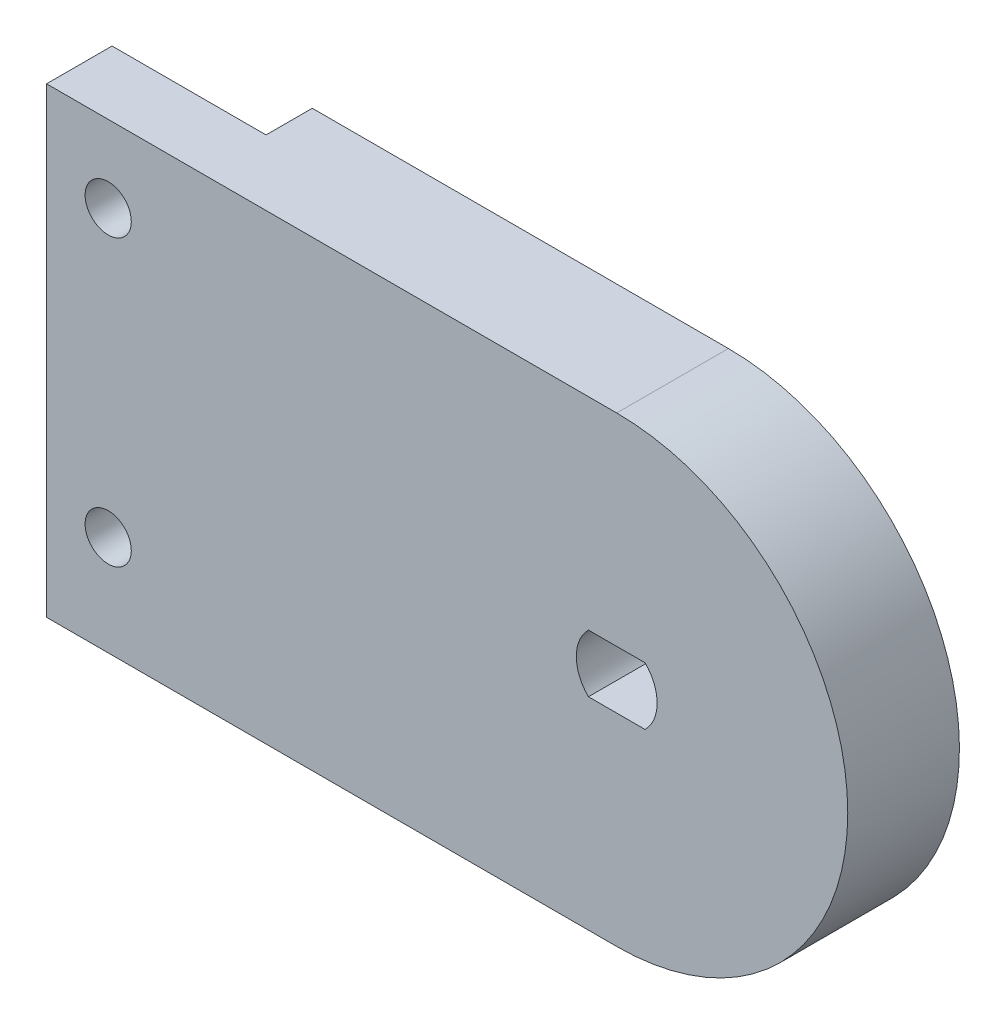
ISO-10303-21;
HEADER;
FILE_DESCRIPTION(('STEP AP214'),'2;1');
FILE_NAME('part.step','',(''),(''),'','','');
FILE_SCHEMA(('AUTOMOTIVE_DESIGN { 1 0 10303 214 1 1 1 1 }'));
ENDSEC;
DATA;
#1=APPLICATION_CONTEXT('core data for automotive mechanical design processes');
#2=APPLICATION_PROTOCOL_DEFINITION('international standard','automotive_design',2000,#1);
#3=PRODUCT_CONTEXT('',#1,'mechanical');
#4=PRODUCT('Part','Part','',(#3));
#5=PRODUCT_RELATED_PRODUCT_CATEGORY('part','',(#4));
#6=PRODUCT_DEFINITION_FORMATION('','',#4);
#7=PRODUCT_DEFINITION_CONTEXT('part definition',#1,'design');
#8=PRODUCT_DEFINITION('design','',#6,#7);
#9=PRODUCT_DEFINITION_SHAPE('','',#8);
#10=(LENGTH_UNIT() NAMED_UNIT(*) SI_UNIT(.MILLI.,.METRE.));
#11=(NAMED_UNIT(*) PLANE_ANGLE_UNIT() SI_UNIT($,.RADIAN.));
#12=(NAMED_UNIT(*) SI_UNIT($,.STERADIAN.) SOLID_ANGLE_UNIT());
#13=UNCERTAINTY_MEASURE_WITH_UNIT(LENGTH_MEASURE(1.E-05),#10,'distance_accuracy_value','');
#14=(GEOMETRIC_REPRESENTATION_CONTEXT(3) GLOBAL_UNCERTAINTY_ASSIGNED_CONTEXT((#13)) GLOBAL_UNIT_ASSIGNED_CONTEXT((#10,
#11,#12)) REPRESENTATION_CONTEXT('',''));
#15=CARTESIAN_POINT('',(0.,0.,0.));
#16=DIRECTION('',(0.,0.,1.));
#17=DIRECTION('',(1.,0.,0.));
#18=AXIS2_PLACEMENT_3D('',#15,#16,#17);
#19=CARTESIAN_POINT('',(-62.7873867556089,0.,0.));
#20=DIRECTION('',(-1.,0.,0.));
#21=DIRECTION('',(0.,0.,1.));
#22=AXIS2_PLACEMENT_3D('',#19,#20,#21);
#23=PLANE('',#22);
#24=DIRECTION('',(0.,0.,1.));
#25=VECTOR('',#24,1.);
#26=CARTESIAN_POINT('',(-62.7873867556089,215.180299853942,-36.0000000000004));
#27=LINE('',#26,#25);
#28=CARTESIAN_POINT('',(-62.7873867556089,215.180299853942,-33.0000000000004));
#29=VERTEX_POINT('',#28);
#30=CARTESIAN_POINT('',(-62.7873867556089,215.180299853942,-28.7500000000003));
#31=VERTEX_POINT('',#30);
#32=EDGE_CURVE('E138',#29,#31,#27,.T.);
#33=ORIENTED_EDGE('',*,*,#32,.T.);
#34=DIRECTION('',(0.,1.,0.));
#35=VECTOR('',#34,1.);
#36=CARTESIAN_POINT('',(-62.7873867556089,0.,-28.7500000000003));
#37=LINE('',#36,#35);
#38=CARTESIAN_POINT('',(-62.7873867556089,245.180299853942,-28.7500000000003));
#39=VERTEX_POINT('',#38);
#40=EDGE_CURVE('E123',#31,#39,#37,.T.);
#41=ORIENTED_EDGE('',*,*,#40,.T.);
#42=DIRECTION('',(0.,0.,-1.));
#43=VECTOR('',#42,1.);
#44=CARTESIAN_POINT('',(-62.7873867556089,245.180299853942,-36.0000000000004));
#45=LINE('',#44,#43);
#46=CARTESIAN_POINT('',(-62.7873867556089,245.180299853942,-33.0000000000004));
#47=VERTEX_POINT('',#46);
#48=EDGE_CURVE('E135',#39,#47,#45,.T.);
#49=ORIENTED_EDGE('',*,*,#48,.T.);
#50=DIRECTION('',(0.,-1.,0.));
#51=VECTOR('',#50,1.);
#52=CARTESIAN_POINT('',(-62.7873867556089,0.,-33.0000000000004));
#53=LINE('',#52,#51);
#54=EDGE_CURVE('E246',#47,#29,#53,.T.);
#55=ORIENTED_EDGE('',*,*,#54,.T.);
#56=EDGE_LOOP('',(#33,#41,#49,#55));
#57=FACE_BOUND('',#56,.T.);
#58=ADVANCED_FACE('F39',(#57),#23,.T.);
#59=CARTESIAN_POINT('',(-54.7873867556089,215.180299853942,-2.60208521396521E-13));
#60=DIRECTION('',(0.,1.,0.));
#61=DIRECTION('',(0.,0.,1.));
#62=AXIS2_PLACEMENT_3D('',#59,#60,#61);
#63=PLANE('',#62);
#64=DIRECTION('',(1.,0.,0.));
#65=VECTOR('',#64,1.);
#66=CARTESIAN_POINT('',(-39.7873867556089,215.180299853942,-28.7500000000003));
#67=LINE('',#66,#65);
#68=CARTESIAN_POINT('',(-25.7691853433519,215.180299853942,-28.7500000000003));
#69=VERTEX_POINT('',#68);
#70=EDGE_CURVE('E188',#31,#69,#67,.T.);
#71=ORIENTED_EDGE('',*,*,#70,.F.);
#72=ORIENTED_EDGE('',*,*,#32,.F.);
#73=DIRECTION('',(-1.,0.,0.));
#74=VECTOR('',#73,1.);
#75=CARTESIAN_POINT('',(-52.7873867569757,215.180299853942,-33.0000000000004));
#76=LINE('',#75,#74);
#77=CARTESIAN_POINT('',(-52.7873867569757,215.180299853942,-33.0000000000004));
#78=VERTEX_POINT('',#77);
#79=EDGE_CURVE('E240',#78,#29,#76,.T.);
#80=ORIENTED_EDGE('',*,*,#79,.F.);
#81=DIRECTION('',(-1.,0.,0.));
#82=VECTOR('',#81,1.);
#83=CARTESIAN_POINT('',(-10.7691853433519,215.180299853942,-33.0000000000004));
#84=LINE('',#83,#82);
#85=CARTESIAN_POINT('',(-25.7691853433519,215.180299853942,-33.0000000000004));
#86=VERTEX_POINT('',#85);
#87=EDGE_CURVE('E203',#86,#78,#84,.T.);
#88=ORIENTED_EDGE('',*,*,#87,.F.);
#89=DIRECTION('',(0.,0.,1.));
#90=VECTOR('',#89,1.);
#91=CARTESIAN_POINT('',(-25.7691853433519,215.180299853942,-36.0000000000003));
#92=LINE('',#91,#90);
#93=EDGE_CURVE('E149',#86,#69,#92,.T.);
#94=ORIENTED_EDGE('',*,*,#93,.T.);
#95=EDGE_LOOP('',(#71,#72,#80,#88,#94));
#96=FACE_BOUND('',#95,.T.);
#97=ADVANCED_FACE('F177',(#96),#63,.F.);
#98=CARTESIAN_POINT('',(-25.7691853433519,245.180299853942,-2.60208521396521E-13));
#99=DIRECTION('',(0.,-1.,0.));
#100=DIRECTION('',(0.,0.,-1.));
#101=AXIS2_PLACEMENT_3D('',#98,#99,#100);
#102=PLANE('',#101);
#103=ORIENTED_EDGE('',*,*,#48,.F.);
#104=DIRECTION('',(-1.,0.,0.));
#105=VECTOR('',#104,1.);
#106=CARTESIAN_POINT('',(-25.7691853433519,245.180299853942,-28.7500000000003));
#107=LINE('',#106,#105);
#108=CARTESIAN_POINT('',(-25.7691853433519,245.180299853942,-28.7500000000003));
#109=VERTEX_POINT('',#108);
#110=EDGE_CURVE('E120',#109,#39,#107,.T.);
#111=ORIENTED_EDGE('',*,*,#110,.F.);
#112=DIRECTION('',(0.,0.,1.));
#113=VECTOR('',#112,1.);
#114=CARTESIAN_POINT('',(-25.7691853433519,245.180299853942,-36.0000000000003));
#115=LINE('',#114,#113);
#116=CARTESIAN_POINT('',(-25.7691853433519,245.180299853942,-36.0000000000003));
#117=VERTEX_POINT('',#116);
#118=EDGE_CURVE('E231',#117,#109,#115,.T.);
#119=ORIENTED_EDGE('',*,*,#118,.F.);
#120=DIRECTION('',(1.,0.,0.));
#121=VECTOR('',#120,1.);
#122=CARTESIAN_POINT('',(-62.7873867556089,245.180299853942,-36.0000000000004));
#123=LINE('',#122,#121);
#124=CARTESIAN_POINT('',(-52.7873867569757,245.180299853942,-36.0000000000004));
#125=VERTEX_POINT('',#124);
#126=EDGE_CURVE('E145',#125,#117,#123,.T.);
#127=ORIENTED_EDGE('',*,*,#126,.F.);
#128=DIRECTION('',(0.,0.,1.));
#129=VECTOR('',#128,1.);
#130=CARTESIAN_POINT('',(-52.7873867569757,245.180299853942,-2.60208521396521E-13));
#131=LINE('',#130,#129);
#132=CARTESIAN_POINT('',(-52.7873867569757,245.180299853942,-33.0000000000004));
#133=VERTEX_POINT('',#132);
#134=EDGE_CURVE('E192',#125,#133,#131,.T.);
#135=ORIENTED_EDGE('',*,*,#134,.T.);
#136=DIRECTION('',(1.,0.,0.));
#137=VECTOR('',#136,1.);
#138=CARTESIAN_POINT('',(-25.7691853433519,245.180299853942,-33.0000000000004));
#139=LINE('',#138,#137);
#140=EDGE_CURVE('E144',#47,#133,#139,.T.);
#141=ORIENTED_EDGE('',*,*,#140,.F.);
#142=EDGE_LOOP('',(#103,#111,#119,#127,#135,#141));
#143=FACE_BOUND('',#142,.T.);
#144=ADVANCED_FACE('F41',(#143),#102,.F.);
#145=CARTESIAN_POINT('',(-58.7873431196309,221.679985831261,-40.2426406871329));
#146=DIRECTION('',(0.,0.,1.));
#147=DIRECTION('',(1.,0.,0.));
#148=AXIS2_PLACEMENT_3D('',#145,#146,#147);
#149=CYLINDRICAL_SURFACE('',#148,1.49999999994292);
#150=CARTESIAN_POINT('',(-58.7873431196309,221.679985831261,-33.0000000000004));
#151=DIRECTION('',(0.,0.,-1.));
#152=DIRECTION('',(-1.,0.,0.));
#153=AXIS2_PLACEMENT_3D('',#150,#151,#152);
#154=CIRCLE('',#153,1.49999999994292);
#155=CARTESIAN_POINT('',(-57.287343119688,221.679985831261,-33.0000000000004));
#156=VERTEX_POINT('',#155);
#157=EDGE_CURVE('E139',#156,#156,#154,.T.);
#158=CARTESIAN_POINT('',(-58.7873431196309,221.679985831261,-28.7500000000003));
#159=DIRECTION('',(0.,0.,1.));
#160=DIRECTION('',(1.,0.,0.));
#161=AXIS2_PLACEMENT_3D('',#158,#159,#160);
#162=CIRCLE('',#161,1.49999999994292);
#163=CARTESIAN_POINT('',(-57.287343119688,221.679985831261,-28.7500000000003));
#164=VERTEX_POINT('',#163);
#165=EDGE_CURVE('E140',#164,#164,#162,.F.);
#166=CARTESIAN_POINT('',(-57.287343119688,221.679985831261,-33.0000000000004));
#167=CARTESIAN_POINT('',(-57.287343119688,221.679985831261,-32.955729166667));
#168=CARTESIAN_POINT('',(-57.287343119688,221.679985831261,-32.9114583333337));
#169=CARTESIAN_POINT('',(-57.287343119688,221.679985831261,-32.822916666667));
#170=CARTESIAN_POINT('',(-57.287343119688,221.679985831261,-32.7786458333337));
#171=CARTESIAN_POINT('',(-57.287343119688,221.679985831261,-32.690104166667));
#172=CARTESIAN_POINT('',(-57.287343119688,221.679985831261,-32.6458333333337));
#173=CARTESIAN_POINT('',(-57.287343119688,221.679985831261,-32.557291666667));
#174=CARTESIAN_POINT('',(-57.287343119688,221.679985831261,-32.5130208333337));
#175=CARTESIAN_POINT('',(-57.287343119688,221.679985831261,-32.424479166667));
#176=CARTESIAN_POINT('',(-57.287343119688,221.679985831261,-32.3802083333337));
#177=CARTESIAN_POINT('',(-57.287343119688,221.679985831261,-32.291666666667));
#178=CARTESIAN_POINT('',(-57.287343119688,221.679985831261,-32.2473958333337));
#179=CARTESIAN_POINT('',(-57.287343119688,221.679985831261,-32.158854166667));
#180=CARTESIAN_POINT('',(-57.287343119688,221.679985831261,-32.1145833333337));
#181=CARTESIAN_POINT('',(-57.287343119688,221.679985831261,-32.026041666667));
#182=CARTESIAN_POINT('',(-57.287343119688,221.679985831261,-31.9817708333337));
#183=CARTESIAN_POINT('',(-57.287343119688,221.679985831261,-31.893229166667));
#184=CARTESIAN_POINT('',(-57.287343119688,221.679985831261,-31.8489583333337));
#185=CARTESIAN_POINT('',(-57.287343119688,221.679985831261,-31.760416666667));
#186=CARTESIAN_POINT('',(-57.287343119688,221.679985831261,-31.7161458333337));
#187=CARTESIAN_POINT('',(-57.287343119688,221.679985831261,-31.627604166667));
#188=CARTESIAN_POINT('',(-57.287343119688,221.679985831261,-31.5833333333337));
#189=CARTESIAN_POINT('',(-57.287343119688,221.679985831261,-31.494791666667));
#190=CARTESIAN_POINT('',(-57.287343119688,221.679985831261,-31.4505208333337));
#191=CARTESIAN_POINT('',(-57.287343119688,221.679985831261,-31.361979166667));
#192=CARTESIAN_POINT('',(-57.287343119688,221.679985831261,-31.3177083333337));
#193=CARTESIAN_POINT('',(-57.287343119688,221.679985831261,-31.229166666667));
#194=CARTESIAN_POINT('',(-57.287343119688,221.679985831261,-31.1848958333337));
#195=CARTESIAN_POINT('',(-57.287343119688,221.679985831261,-31.096354166667));
#196=CARTESIAN_POINT('',(-57.287343119688,221.679985831261,-31.0520833333337));
#197=CARTESIAN_POINT('',(-57.287343119688,221.679985831261,-30.963541666667));
#198=CARTESIAN_POINT('',(-57.287343119688,221.679985831261,-30.9192708333337));
#199=CARTESIAN_POINT('',(-57.287343119688,221.679985831261,-30.830729166667));
#200=CARTESIAN_POINT('',(-57.287343119688,221.679985831261,-30.7864583333336));
#201=CARTESIAN_POINT('',(-57.287343119688,221.679985831261,-30.697916666667));
#202=CARTESIAN_POINT('',(-57.287343119688,221.679985831261,-30.6536458333336));
#203=CARTESIAN_POINT('',(-57.287343119688,221.679985831261,-30.565104166667));
#204=CARTESIAN_POINT('',(-57.287343119688,221.679985831261,-30.5208333333336));
#205=CARTESIAN_POINT('',(-57.287343119688,221.679985831261,-30.432291666667));
#206=CARTESIAN_POINT('',(-57.287343119688,221.679985831261,-30.3880208333336));
#207=CARTESIAN_POINT('',(-57.287343119688,221.679985831261,-30.299479166667));
#208=CARTESIAN_POINT('',(-57.287343119688,221.679985831261,-30.2552083333336));
#209=CARTESIAN_POINT('',(-57.287343119688,221.679985831261,-30.166666666667));
#210=CARTESIAN_POINT('',(-57.287343119688,221.679985831261,-30.1223958333336));
#211=CARTESIAN_POINT('',(-57.287343119688,221.679985831261,-30.033854166667));
#212=CARTESIAN_POINT('',(-57.287343119688,221.679985831261,-29.9895833333336));
#213=CARTESIAN_POINT('',(-57.287343119688,221.679985831261,-29.901041666667));
#214=CARTESIAN_POINT('',(-57.287343119688,221.679985831261,-29.8567708333336));
#215=CARTESIAN_POINT('',(-57.287343119688,221.679985831261,-29.768229166667));
#216=CARTESIAN_POINT('',(-57.287343119688,221.679985831261,-29.7239583333336));
#217=CARTESIAN_POINT('',(-57.287343119688,221.679985831261,-29.6354166666669));
#218=CARTESIAN_POINT('',(-57.287343119688,221.679985831261,-29.5911458333336));
#219=CARTESIAN_POINT('',(-57.287343119688,221.679985831261,-29.5026041666669));
#220=CARTESIAN_POINT('',(-57.287343119688,221.679985831261,-29.4583333333336));
#221=CARTESIAN_POINT('',(-57.287343119688,221.679985831261,-29.3697916666669));
#222=CARTESIAN_POINT('',(-57.287343119688,221.679985831261,-29.3255208333336));
#223=CARTESIAN_POINT('',(-57.287343119688,221.679985831261,-29.2369791666669));
#224=CARTESIAN_POINT('',(-57.287343119688,221.679985831261,-29.1927083333336));
#225=CARTESIAN_POINT('',(-57.287343119688,221.679985831261,-29.1041666666669));
#226=CARTESIAN_POINT('',(-57.287343119688,221.679985831261,-29.0598958333336));
#227=CARTESIAN_POINT('',(-57.287343119688,221.679985831261,-28.9713541666669));
#228=CARTESIAN_POINT('',(-57.287343119688,221.679985831261,-28.9270833333336));
#229=CARTESIAN_POINT('',(-57.287343119688,221.679985831261,-28.8385416666669));
#230=CARTESIAN_POINT('',(-57.287343119688,221.679985831261,-28.7942708333336));
#231=CARTESIAN_POINT('',(-57.287343119688,221.679985831261,-28.7500000000003));
#232=B_SPLINE_CURVE_WITH_KNOTS('',3,(#166,#167,#168,#169,#170,#171,#172,#173,#174,#175,#176,
#177,#178,#179,#180,#181,#182,#183,#184,#185,#186,#187,#188,#189,#190,#191,#192,#193,#194,#195,
#196,#197,#198,#199,#200,#201,#202,#203,#204,#205,#206,#207,#208,#209,#210,#211,#212,#213,#214,
#215,#216,#217,#218,#219,#220,#221,#222,#223,#224,#225,#226,#227,#228,#229,#230,#231),
.UNSPECIFIED.,.F.,.F.,(4,2,2,2,2,2,2,2,2,2,2,2,2,2,2,2,2,2,2,2,2,2,2,2,2,2,2,2,2,2,2,2,4),(0.,
0.132812500000003,0.265625000000005,0.398437500000008,0.531250000000011,0.664062500000014,
0.796875000000016,0.929687500000019,1.06250000000003,1.19531250000002,1.32812500000003,
1.46093750000004,1.59375000000004,1.72656250000004,1.85937500000005,1.99218750000005,
2.12500000000005,2.25781250000006,2.39062500000006,2.52343750000007,2.65625000000007,
2.78906250000007,2.92187500000007,3.05468750000008,3.18750000000008,3.32031250000009,
3.45312500000009,3.58593750000009,3.7187500000001,3.8515625000001,3.9843750000001,
4.1171875000001,4.25000000000011),.UNSPECIFIED.);
#233=EDGE_CURVE('BSEAM186',#156,#164,#232,.T.);
#234=ORIENTED_EDGE('',*,*,#157,.T.);
#235=ORIENTED_EDGE('',*,*,#165,.F.);
#236=ORIENTED_EDGE('',*,*,#233,.T.);
#237=ORIENTED_EDGE('',*,*,#233,.F.);
#238=EDGE_LOOP('',(#234,#236,#235,#237));
#239=FACE_BOUND('',#238,.T.);
#240=ADVANCED_FACE('F186',(#239),#149,.F.);
#241=CARTESIAN_POINT('',(-58.7873431203192,240.180255147659,-40.2426406871329));
#242=DIRECTION('',(0.,0.,1.));
#243=DIRECTION('',(1.,0.,0.));
#244=AXIS2_PLACEMENT_3D('',#241,#242,#243);
#245=CYLINDRICAL_SURFACE('',#244,1.49999999994294);
#246=CARTESIAN_POINT('',(-58.7873431203192,240.180255147659,-33.0000000000004));
#247=DIRECTION('',(0.,0.,-1.));
#248=DIRECTION('',(-1.,0.,0.));
#249=AXIS2_PLACEMENT_3D('',#246,#247,#248);
#250=CIRCLE('',#249,1.49999999994294);
#251=CARTESIAN_POINT('',(-57.2873431203763,240.180255147659,-33.0000000000004));
#252=VERTEX_POINT('',#251);
#253=EDGE_CURVE('E238',#252,#252,#250,.T.);
#254=CARTESIAN_POINT('',(-58.7873431203192,240.180255147659,-28.7500000000003));
#255=DIRECTION('',(0.,0.,1.));
#256=DIRECTION('',(1.,0.,0.));
#257=AXIS2_PLACEMENT_3D('',#254,#255,#256);
#258=CIRCLE('',#257,1.49999999994294);
#259=CARTESIAN_POINT('',(-57.2873431203763,240.180255147659,-28.7500000000003));
#260=VERTEX_POINT('',#259);
#261=EDGE_CURVE('E43',#260,#260,#258,.F.);
#262=CARTESIAN_POINT('',(-57.2873431203763,240.180255147659,-33.0000000000004));
#263=CARTESIAN_POINT('',(-57.2873431203763,240.180255147659,-32.955729166667));
#264=CARTESIAN_POINT('',(-57.2873431203763,240.180255147659,-32.9114583333337));
#265=CARTESIAN_POINT('',(-57.2873431203763,240.180255147659,-32.822916666667));
#266=CARTESIAN_POINT('',(-57.2873431203763,240.180255147659,-32.7786458333337));
#267=CARTESIAN_POINT('',(-57.2873431203763,240.180255147659,-32.690104166667));
#268=CARTESIAN_POINT('',(-57.2873431203763,240.180255147659,-32.6458333333337));
#269=CARTESIAN_POINT('',(-57.2873431203763,240.180255147659,-32.557291666667));
#270=CARTESIAN_POINT('',(-57.2873431203763,240.180255147659,-32.5130208333337));
#271=CARTESIAN_POINT('',(-57.2873431203763,240.180255147659,-32.424479166667));
#272=CARTESIAN_POINT('',(-57.2873431203763,240.180255147659,-32.3802083333337));
#273=CARTESIAN_POINT('',(-57.2873431203763,240.180255147659,-32.291666666667));
#274=CARTESIAN_POINT('',(-57.2873431203763,240.180255147659,-32.2473958333337));
#275=CARTESIAN_POINT('',(-57.2873431203763,240.180255147659,-32.158854166667));
#276=CARTESIAN_POINT('',(-57.2873431203763,240.180255147659,-32.1145833333337));
#277=CARTESIAN_POINT('',(-57.2873431203763,240.180255147659,-32.026041666667));
#278=CARTESIAN_POINT('',(-57.2873431203763,240.180255147659,-31.9817708333337));
#279=CARTESIAN_POINT('',(-57.2873431203763,240.180255147659,-31.893229166667));
#280=CARTESIAN_POINT('',(-57.2873431203763,240.180255147659,-31.8489583333337));
#281=CARTESIAN_POINT('',(-57.2873431203763,240.180255147659,-31.760416666667));
#282=CARTESIAN_POINT('',(-57.2873431203763,240.180255147659,-31.7161458333337));
#283=CARTESIAN_POINT('',(-57.2873431203763,240.180255147659,-31.627604166667));
#284=CARTESIAN_POINT('',(-57.2873431203763,240.180255147659,-31.5833333333337));
#285=CARTESIAN_POINT('',(-57.2873431203763,240.180255147659,-31.494791666667));
#286=CARTESIAN_POINT('',(-57.2873431203763,240.180255147659,-31.4505208333337));
#287=CARTESIAN_POINT('',(-57.2873431203763,240.180255147659,-31.361979166667));
#288=CARTESIAN_POINT('',(-57.2873431203763,240.180255147659,-31.3177083333337));
#289=CARTESIAN_POINT('',(-57.2873431203763,240.180255147659,-31.229166666667));
#290=CARTESIAN_POINT('',(-57.2873431203763,240.180255147659,-31.1848958333337));
#291=CARTESIAN_POINT('',(-57.2873431203763,240.180255147659,-31.096354166667));
#292=CARTESIAN_POINT('',(-57.2873431203763,240.180255147659,-31.0520833333337));
#293=CARTESIAN_POINT('',(-57.2873431203763,240.180255147659,-30.963541666667));
#294=CARTESIAN_POINT('',(-57.2873431203763,240.180255147659,-30.9192708333337));
#295=CARTESIAN_POINT('',(-57.2873431203763,240.180255147659,-30.830729166667));
#296=CARTESIAN_POINT('',(-57.2873431203763,240.180255147659,-30.7864583333336));
#297=CARTESIAN_POINT('',(-57.2873431203763,240.180255147659,-30.697916666667));
#298=CARTESIAN_POINT('',(-57.2873431203763,240.180255147659,-30.6536458333336));
#299=CARTESIAN_POINT('',(-57.2873431203763,240.180255147659,-30.565104166667));
#300=CARTESIAN_POINT('',(-57.2873431203763,240.180255147659,-30.5208333333336));
#301=CARTESIAN_POINT('',(-57.2873431203763,240.180255147659,-30.432291666667));
#302=CARTESIAN_POINT('',(-57.2873431203763,240.180255147659,-30.3880208333336));
#303=CARTESIAN_POINT('',(-57.2873431203763,240.180255147659,-30.299479166667));
#304=CARTESIAN_POINT('',(-57.2873431203763,240.180255147659,-30.2552083333336));
#305=CARTESIAN_POINT('',(-57.2873431203763,240.180255147659,-30.166666666667));
#306=CARTESIAN_POINT('',(-57.2873431203763,240.180255147659,-30.1223958333336));
#307=CARTESIAN_POINT('',(-57.2873431203763,240.180255147659,-30.033854166667));
#308=CARTESIAN_POINT('',(-57.2873431203763,240.180255147659,-29.9895833333336));
#309=CARTESIAN_POINT('',(-57.2873431203763,240.180255147659,-29.901041666667));
#310=CARTESIAN_POINT('',(-57.2873431203763,240.180255147659,-29.8567708333336));
#311=CARTESIAN_POINT('',(-57.2873431203763,240.180255147659,-29.768229166667));
#312=CARTESIAN_POINT('',(-57.2873431203763,240.180255147659,-29.7239583333336));
#313=CARTESIAN_POINT('',(-57.2873431203763,240.180255147659,-29.6354166666669));
#314=CARTESIAN_POINT('',(-57.2873431203763,240.180255147659,-29.5911458333336));
#315=CARTESIAN_POINT('',(-57.2873431203763,240.180255147659,-29.5026041666669));
#316=CARTESIAN_POINT('',(-57.2873431203763,240.180255147659,-29.4583333333336));
#317=CARTESIAN_POINT('',(-57.2873431203763,240.180255147659,-29.3697916666669));
#318=CARTESIAN_POINT('',(-57.2873431203763,240.180255147659,-29.3255208333336));
#319=CARTESIAN_POINT('',(-57.2873431203763,240.180255147659,-29.2369791666669));
#320=CARTESIAN_POINT('',(-57.2873431203763,240.180255147659,-29.1927083333336));
#321=CARTESIAN_POINT('',(-57.2873431203763,240.180255147659,-29.1041666666669));
#322=CARTESIAN_POINT('',(-57.2873431203763,240.180255147659,-29.0598958333336));
#323=CARTESIAN_POINT('',(-57.2873431203763,240.180255147659,-28.9713541666669));
#324=CARTESIAN_POINT('',(-57.2873431203763,240.180255147659,-28.9270833333336));
#325=CARTESIAN_POINT('',(-57.2873431203763,240.180255147659,-28.8385416666669));
#326=CARTESIAN_POINT('',(-57.2873431203763,240.180255147659,-28.7942708333336));
#327=CARTESIAN_POINT('',(-57.2873431203763,240.180255147659,-28.7500000000003));
#328=B_SPLINE_CURVE_WITH_KNOTS('',3,(#262,#263,#264,#265,#266,#267,#268,#269,#270,#271,#272,
#273,#274,#275,#276,#277,#278,#279,#280,#281,#282,#283,#284,#285,#286,#287,#288,#289,#290,#291,
#292,#293,#294,#295,#296,#297,#298,#299,#300,#301,#302,#303,#304,#305,#306,#307,#308,#309,#310,
#311,#312,#313,#314,#315,#316,#317,#318,#319,#320,#321,#322,#323,#324,#325,#326,#327),
.UNSPECIFIED.,.F.,.F.,(4,2,2,2,2,2,2,2,2,2,2,2,2,2,2,2,2,2,2,2,2,2,2,2,2,2,2,2,2,2,2,2,4),(0.,
0.132812500000003,0.265625000000005,0.398437500000008,0.531250000000011,0.664062500000014,
0.796875000000016,0.929687500000019,1.06250000000003,1.19531250000002,1.32812500000003,
1.46093750000004,1.59375000000004,1.72656250000004,1.85937500000005,1.99218750000005,
2.12500000000005,2.25781250000006,2.39062500000006,2.52343750000007,2.65625000000007,
2.78906250000007,2.92187500000007,3.05468750000008,3.18750000000008,3.32031250000009,
3.45312500000009,3.58593750000009,3.7187500000001,3.8515625000001,3.9843750000001,
4.1171875000001,4.25000000000011),.UNSPECIFIED.);
#329=EDGE_CURVE('BSEAM171',#252,#260,#328,.T.);
#330=ORIENTED_EDGE('',*,*,#253,.T.);
#331=ORIENTED_EDGE('',*,*,#261,.F.);
#332=ORIENTED_EDGE('',*,*,#329,.T.);
#333=ORIENTED_EDGE('',*,*,#329,.F.);
#334=EDGE_LOOP('',(#330,#332,#331,#333));
#335=FACE_BOUND('',#334,.T.);
#336=ADVANCED_FACE('F171',(#335),#245,.F.);
#337=CARTESIAN_POINT('',(-25.7691853433519,230.180299853942,-36.0000000000003));
#338=DIRECTION('',(0.,0.,1.));
#339=DIRECTION('',(1.,0.,0.));
#340=AXIS2_PLACEMENT_3D('',#337,#338,#339);
#341=CYLINDRICAL_SURFACE('',#340,15.);
#342=CARTESIAN_POINT('',(-25.7691853433519,230.180299853942,-28.7500000000003));
#343=DIRECTION('',(0.,0.,1.));
#344=DIRECTION('',(1.,0.,0.));
#345=AXIS2_PLACEMENT_3D('',#342,#343,#344);
#346=CIRCLE('',#345,15.);
#347=EDGE_CURVE('E126',#69,#109,#346,.T.);
#348=ORIENTED_EDGE('',*,*,#347,.F.);
#349=ORIENTED_EDGE('',*,*,#93,.F.);
#350=CARTESIAN_POINT('',(-16.7691853433519,218.180299853942,-36.0000000000004));
#351=CARTESIAN_POINT('',(-16.8637550446191,218.109370320266,-35.9999932056433));
#352=CARTESIAN_POINT('',(-16.9591419817563,218.039579436653,-35.9974854146663));
#353=CARTESIAN_POINT('',(-17.1513559725914,217.902395165938,-35.9878928538421));
#354=CARTESIAN_POINT('',(-17.2481825614646,217.835001027845,-35.9808095312507));
#355=CARTESIAN_POINT('',(-17.5402309828788,217.636792375512,-35.9533674517834));
#356=CARTESIAN_POINT('',(-17.7374010252159,217.509667175579,-35.9268131310636));
#357=CARTESIAN_POINT('',(-18.1343497962458,217.26662046418,-35.860237585269));
#358=CARTESIAN_POINT('',(-18.3341017853403,217.150628854987,-35.8203088579665));
#359=CARTESIAN_POINT('',(-18.7368434768534,216.9289206147,-35.7291784881881));
#360=CARTESIAN_POINT('',(-18.939835225425,216.823210802554,-35.6779694370364));
#361=CARTESIAN_POINT('',(-19.4783935999208,216.558084553471,-35.530594779413));
#362=CARTESIAN_POINT('',(-19.8160926836503,216.407318624022,-35.4265628456442));
#363=CARTESIAN_POINT('',(-20.4962086584253,216.132868305154,-35.1999310983356));
#364=CARTESIAN_POINT('',(-20.8386274882105,216.009195419883,-35.0773234344721));
#365=CARTESIAN_POINT('',(-21.5280877946361,215.787778134915,-34.8179707411285));
#366=CARTESIAN_POINT('',(-21.875142093103,215.690136760723,-34.6811724293425));
#367=CARTESIAN_POINT('',(-22.5713958527746,215.520747538824,-34.397858460873));
#368=CARTESIAN_POINT('',(-22.9205945900176,215.448991393681,-34.251345935912));
#369=CARTESIAN_POINT('',(-23.6823320050216,215.320303181177,-33.9253762407096));
#370=CARTESIAN_POINT('',(-24.0951574721624,215.26823255738,-33.744673043725));
#371=CARTESIAN_POINT('',(-24.9209823072888,215.198582642408,-33.3792950961624));
#372=CARTESIAN_POINT('',(-25.3339795250019,215.180931789055,-33.1946293944786));
#373=CARTESIAN_POINT('',(-25.7542782718378,215.180305412409,-33.0066666448442));
#374=CARTESIAN_POINT('',(-25.7617318343437,215.180299857049,-33.0033333100232));
#375=CARTESIAN_POINT('',(-25.7691853433519,215.180299853942,-33.0000000000004));
#376=B_SPLINE_CURVE_WITH_KNOTS('',3,(#350,#351,#352,#353,#354,#355,#356,#357,#358,#359,#360,
#361,#362,#363,#364,#365,#366,#367,#368,#369,#370,#371,#372,#373,#374,#375),.UNSPECIFIED.,.F.,
.F.,(4,2,2,2,2,2,2,2,2,2,2,2,4),(0.,0.354557245541615,0.709002398320903,1.41647465132648,
2.11915170063482,2.82229163656689,3.97305248013343,5.12430101246704,6.28004041349351,
7.43540901561578,8.79497710138108,10.1517154813215,10.1762103844329),.UNSPECIFIED.);
#377=CARTESIAN_POINT('',(-16.7691853433519,218.180299853942,-36.0000000000003));
#378=VERTEX_POINT('',#377);
#379=EDGE_CURVE('E147',#86,#378,#376,.F.);
#380=ORIENTED_EDGE('',*,*,#379,.T.);
#381=CARTESIAN_POINT('',(-25.7691853433519,230.180299853942,-36.0000000000003));
#382=DIRECTION('',(0.,0.,-1.));
#383=DIRECTION('',(-1.,0.,0.));
#384=AXIS2_PLACEMENT_3D('',#381,#382,#383);
#385=CIRCLE('',#384,15.);
#386=EDGE_CURVE('E228',#117,#378,#385,.T.);
#387=ORIENTED_EDGE('',*,*,#386,.F.);
#388=ORIENTED_EDGE('',*,*,#118,.T.);
#389=EDGE_LOOP('',(#348,#349,#380,#387,#388));
#390=FACE_BOUND('',#389,.T.);
#391=ADVANCED_FACE('F165',(#390),#341,.T.);
#392=CARTESIAN_POINT('',(-25.7691853433519,230.180299853942,6.45174395028171));
#393=DIRECTION('',(0.,0.,-1.));
#394=DIRECTION('',(-1.,0.,0.));
#395=AXIS2_PLACEMENT_3D('',#392,#393,#394);
#396=CYLINDRICAL_SURFACE('',#395,2.625);
#397=CARTESIAN_POINT('',(-25.7691853433519,230.180299853942,-28.7500000000003));
#398=DIRECTION('',(0.,0.,1.));
#399=DIRECTION('',(1.,0.,0.));
#400=AXIS2_PLACEMENT_3D('',#397,#398,#399);
#401=CIRCLE('',#400,2.625);
#402=CARTESIAN_POINT('',(-23.9320680362645,232.055299853942,-28.7500000000003));
#403=VERTEX_POINT('',#402);
#404=CARTESIAN_POINT('',(-23.9320680362645,228.305299853942,-28.7500000000003));
#405=VERTEX_POINT('',#404);
#406=EDGE_CURVE('E63',#403,#405,#401,.F.);
#407=ORIENTED_EDGE('',*,*,#406,.F.);
#408=DIRECTION('',(0.,0.,-1.));
#409=VECTOR('',#408,1.);
#410=CARTESIAN_POINT('',(-23.9320680362645,232.055299853942,6.45174395028171));
#411=LINE('',#410,#409);
#412=CARTESIAN_POINT('',(-23.9320680362645,232.055299853942,-36.0000000000004));
#413=VERTEX_POINT('',#412);
#414=EDGE_CURVE('E221',#403,#413,#411,.T.);
#415=ORIENTED_EDGE('',*,*,#414,.T.);
#416=CARTESIAN_POINT('',(-25.7691853433519,230.180299853942,-36.0000000000004));
#417=DIRECTION('',(0.,0.,-1.));
#418=DIRECTION('',(-1.,0.,0.));
#419=AXIS2_PLACEMENT_3D('',#416,#417,#418);
#420=CIRCLE('',#419,2.625);
#421=CARTESIAN_POINT('',(-23.9320680362645,228.305299853942,-36.0000000000004));
#422=VERTEX_POINT('',#421);
#423=EDGE_CURVE('E206',#413,#422,#420,.T.);
#424=ORIENTED_EDGE('',*,*,#423,.T.);
#425=DIRECTION('',(0.,0.,-1.));
#426=VECTOR('',#425,1.);
#427=CARTESIAN_POINT('',(-23.9320680362645,228.305299853942,6.45174395028171));
#428=LINE('',#427,#426);
#429=EDGE_CURVE('E223',#405,#422,#428,.T.);
#430=ORIENTED_EDGE('',*,*,#429,.F.);
#431=EDGE_LOOP('',(#407,#415,#424,#430));
#432=FACE_BOUND('',#431,.T.);
#433=ADVANCED_FACE('F170',(#432),#396,.F.);
#434=CARTESIAN_POINT('',(-23.9320680362645,232.055299853942,6.45174395028171));
#435=DIRECTION('',(0.,1.,0.));
#436=DIRECTION('',(0.,0.,1.));
#437=AXIS2_PLACEMENT_3D('',#434,#435,#436);
#438=PLANE('',#437);
#439=DIRECTION('',(1.,0.,0.));
#440=VECTOR('',#439,1.);
#441=CARTESIAN_POINT('',(-23.9320680362645,232.055299853942,-28.7500000000003));
#442=LINE('',#441,#440);
#443=CARTESIAN_POINT('',(-27.6063026504393,232.055299853942,-28.7500000000003));
#444=VERTEX_POINT('',#443);
#445=EDGE_CURVE('E199',#444,#403,#442,.T.);
#446=ORIENTED_EDGE('',*,*,#445,.F.);
#447=DIRECTION('',(0.,0.,-1.));
#448=VECTOR('',#447,1.);
#449=CARTESIAN_POINT('',(-27.6063026504393,232.055299853942,6.45174395028171));
#450=LINE('',#449,#448);
#451=CARTESIAN_POINT('',(-27.6063026504393,232.055299853942,-36.0000000000004));
#452=VERTEX_POINT('',#451);
#453=EDGE_CURVE('E224',#444,#452,#450,.T.);
#454=ORIENTED_EDGE('',*,*,#453,.T.);
#455=DIRECTION('',(1.,0.,0.));
#456=VECTOR('',#455,1.);
#457=CARTESIAN_POINT('',(-23.9320680362645,232.055299853942,-36.0000000000004));
#458=LINE('',#457,#456);
#459=EDGE_CURVE('E209',#452,#413,#458,.T.);
#460=ORIENTED_EDGE('',*,*,#459,.T.);
#461=ORIENTED_EDGE('',*,*,#414,.F.);
#462=EDGE_LOOP('',(#446,#454,#460,#461));
#463=FACE_BOUND('',#462,.T.);
#464=ADVANCED_FACE('F295',(#463),#438,.F.);
#465=CARTESIAN_POINT('',(-25.7691853433519,230.180299853942,6.45174395028171));
#466=DIRECTION('',(0.,0.,-1.));
#467=DIRECTION('',(-1.,0.,0.));
#468=AXIS2_PLACEMENT_3D('',#465,#466,#467);
#469=CYLINDRICAL_SURFACE('',#468,2.625);
#470=CARTESIAN_POINT('',(-25.7691853433519,230.180299853942,-28.7500000000003));
#471=DIRECTION('',(0.,0.,1.));
#472=DIRECTION('',(1.,0.,0.));
#473=AXIS2_PLACEMENT_3D('',#470,#471,#472);
#474=CIRCLE('',#473,2.625);
#475=CARTESIAN_POINT('',(-27.6063026504392,228.305299853942,-28.7500000000003));
#476=VERTEX_POINT('',#475);
#477=EDGE_CURVE('E131',#476,#444,#474,.F.);
#478=ORIENTED_EDGE('',*,*,#477,.F.);
#479=DIRECTION('',(0.,0.,-1.));
#480=VECTOR('',#479,1.);
#481=CARTESIAN_POINT('',(-27.6063026504392,228.305299853942,6.45174395028171));
#482=LINE('',#481,#480);
#483=CARTESIAN_POINT('',(-27.6063026504392,228.305299853942,-36.0000000000004));
#484=VERTEX_POINT('',#483);
#485=EDGE_CURVE('E212',#476,#484,#482,.T.);
#486=ORIENTED_EDGE('',*,*,#485,.T.);
#487=CARTESIAN_POINT('',(-25.7691853433519,230.180299853942,-36.0000000000004));
#488=DIRECTION('',(0.,0.,-1.));
#489=DIRECTION('',(-1.,0.,0.));
#490=AXIS2_PLACEMENT_3D('',#487,#488,#489);
#491=CIRCLE('',#490,2.625);
#492=EDGE_CURVE('E213',#484,#452,#491,.T.);
#493=ORIENTED_EDGE('',*,*,#492,.T.);
#494=ORIENTED_EDGE('',*,*,#453,.F.);
#495=EDGE_LOOP('',(#478,#486,#493,#494));
#496=FACE_BOUND('',#495,.T.);
#497=ADVANCED_FACE('F302',(#496),#469,.F.);
#498=CARTESIAN_POINT('',(-23.9320680362645,228.305299853942,6.45174395028171));
#499=DIRECTION('',(0.,-1.,0.));
#500=DIRECTION('',(0.,0.,-1.));
#501=AXIS2_PLACEMENT_3D('',#498,#499,#500);
#502=PLANE('',#501);
#503=DIRECTION('',(-1.,0.,0.));
#504=VECTOR('',#503,1.);
#505=CARTESIAN_POINT('',(-23.9320680362645,228.305299853942,-28.7500000000003));
#506=LINE('',#505,#504);
#507=EDGE_CURVE('E48',#405,#476,#506,.T.);
#508=ORIENTED_EDGE('',*,*,#507,.F.);
#509=ORIENTED_EDGE('',*,*,#429,.T.);
#510=DIRECTION('',(-1.,0.,0.));
#511=VECTOR('',#510,1.);
#512=CARTESIAN_POINT('',(-23.9320680362645,228.305299853942,-36.0000000000004));
#513=LINE('',#512,#511);
#514=EDGE_CURVE('E216',#422,#484,#513,.T.);
#515=ORIENTED_EDGE('',*,*,#514,.T.);
#516=ORIENTED_EDGE('',*,*,#485,.F.);
#517=EDGE_LOOP('',(#508,#509,#515,#516));
#518=FACE_BOUND('',#517,.T.);
#519=ADVANCED_FACE('F173',(#518),#502,.F.);
#520=CARTESIAN_POINT('',(-62.7873867556089,245.180299853942,-36.0000000000004));
#521=DIRECTION('',(0.,0.,1.));
#522=DIRECTION('',(1.,0.,0.));
#523=AXIS2_PLACEMENT_3D('',#520,#521,#522);
#524=PLANE('',#523);
#525=ORIENTED_EDGE('',*,*,#492,.F.);
#526=ORIENTED_EDGE('',*,*,#514,.F.);
#527=ORIENTED_EDGE('',*,*,#423,.F.);
#528=ORIENTED_EDGE('',*,*,#459,.F.);
#529=EDGE_LOOP('',(#525,#526,#527,#528));
#530=FACE_BOUND('',#529,.T.);
#531=DIRECTION('',(-1.,0.,0.));
#532=VECTOR('',#531,1.);
#533=CARTESIAN_POINT('',(-10.7691853433519,218.180299853942,-36.0000000000004));
#534=LINE('',#533,#532);
#535=CARTESIAN_POINT('',(-52.7873867569757,218.180299853942,-36.0000000000004));
#536=VERTEX_POINT('',#535);
#537=EDGE_CURVE('E202',#378,#536,#534,.T.);
#538=ORIENTED_EDGE('',*,*,#537,.T.);
#539=DIRECTION('',(0.,-1.,0.));
#540=VECTOR('',#539,1.);
#541=CARTESIAN_POINT('',(-52.7873867569757,245.180325980664,-36.0000000000004));
#542=LINE('',#541,#540);
#543=EDGE_CURVE('E236',#125,#536,#542,.T.);
#544=ORIENTED_EDGE('',*,*,#543,.F.);
#545=ORIENTED_EDGE('',*,*,#126,.T.);
#546=ORIENTED_EDGE('',*,*,#386,.T.);
#547=EDGE_LOOP('',(#538,#544,#545,#546));
#548=FACE_BOUND('',#547,.T.);
#549=ADVANCED_FACE('F178',(#530,#548),#524,.F.);
#550=CARTESIAN_POINT('',(-10.7691853433519,218.180299853942,-33.0000000000004));
#551=DIRECTION('',(-1.,0.,0.));
#552=DIRECTION('',(0.,0.,1.));
#553=AXIS2_PLACEMENT_3D('',#550,#551,#552);
#554=CYLINDRICAL_SURFACE('',#553,3.00000000000001);
#555=ORIENTED_EDGE('',*,*,#87,.T.);
#556=CARTESIAN_POINT('',(-52.7873867569757,218.180299853942,-33.0000000000004));
#557=DIRECTION('',(1.,0.,0.));
#558=DIRECTION('',(0.,1.,0.));
#559=AXIS2_PLACEMENT_3D('',#556,#557,#558);
#560=CIRCLE('',#559,3.00000000000001);
#561=EDGE_CURVE('E11',#78,#536,#560,.T.);
#562=ORIENTED_EDGE('',*,*,#561,.T.);
#563=ORIENTED_EDGE('',*,*,#537,.F.);
#564=ORIENTED_EDGE('',*,*,#379,.F.);
#565=EDGE_LOOP('',(#555,#562,#563,#564));
#566=FACE_BOUND('',#565,.T.);
#567=ADVANCED_FACE('F161',(#566),#554,.T.);
#568=CARTESIAN_POINT('',(-25.7691853433519,230.180299853942,-28.7500000000003));
#569=DIRECTION('',(0.,0.,1.));
#570=DIRECTION('',(1.,0.,0.));
#571=AXIS2_PLACEMENT_3D('',#568,#569,#570);
#572=PLANE('',#571);
#573=ORIENTED_EDGE('',*,*,#110,.T.);
#574=ORIENTED_EDGE('',*,*,#40,.F.);
#575=ORIENTED_EDGE('',*,*,#70,.T.);
#576=ORIENTED_EDGE('',*,*,#347,.T.);
#577=EDGE_LOOP('',(#573,#574,#575,#576));
#578=FACE_BOUND('',#577,.T.);
#579=ORIENTED_EDGE('',*,*,#406,.T.);
#580=ORIENTED_EDGE('',*,*,#507,.T.);
#581=ORIENTED_EDGE('',*,*,#477,.T.);
#582=ORIENTED_EDGE('',*,*,#445,.T.);
#583=EDGE_LOOP('',(#579,#580,#581,#582));
#584=FACE_BOUND('',#583,.T.);
#585=ORIENTED_EDGE('',*,*,#165,.T.);
#586=EDGE_LOOP('',(#585));
#587=FACE_BOUND('',#586,.T.);
#588=ORIENTED_EDGE('',*,*,#261,.T.);
#589=EDGE_LOOP('',(#588));
#590=FACE_BOUND('',#589,.T.);
#591=ADVANCED_FACE('F122',(#578,#584,#587,#590),#572,.T.);
#592=CARTESIAN_POINT('',(-52.7873867569757,245.180325980664,-33.0000000000004));
#593=DIRECTION('',(1.,0.,0.));
#594=DIRECTION('',(0.,1.,0.));
#595=AXIS2_PLACEMENT_3D('',#592,#593,#594);
#596=PLANE('',#595);
#597=ORIENTED_EDGE('',*,*,#543,.T.);
#598=ORIENTED_EDGE('',*,*,#561,.F.);
#599=DIRECTION('',(0.,-1.,0.));
#600=VECTOR('',#599,1.);
#601=CARTESIAN_POINT('',(-52.7873867569757,245.180325980664,-33.0000000000004));
#602=LINE('',#601,#600);
#603=EDGE_CURVE('E55',#133,#78,#602,.T.);
#604=ORIENTED_EDGE('',*,*,#603,.F.);
#605=ORIENTED_EDGE('',*,*,#134,.F.);
#606=EDGE_LOOP('',(#597,#598,#604,#605));
#607=FACE_BOUND('',#606,.T.);
#608=ADVANCED_FACE('F248',(#607),#596,.F.);
#609=CARTESIAN_POINT('',(0.,0.,-33.0000000000004));
#610=DIRECTION('',(0.,0.,-1.));
#611=DIRECTION('',(-1.,0.,0.));
#612=AXIS2_PLACEMENT_3D('',#609,#610,#611);
#613=PLANE('',#612);
#614=ORIENTED_EDGE('',*,*,#253,.F.);
#615=EDGE_LOOP('',(#614));
#616=FACE_BOUND('',#615,.T.);
#617=ORIENTED_EDGE('',*,*,#157,.F.);
#618=EDGE_LOOP('',(#617));
#619=FACE_BOUND('',#618,.T.);
#620=ORIENTED_EDGE('',*,*,#140,.T.);
#621=ORIENTED_EDGE('',*,*,#603,.T.);
#622=ORIENTED_EDGE('',*,*,#79,.T.);
#623=ORIENTED_EDGE('',*,*,#54,.F.);
#624=EDGE_LOOP('',(#620,#621,#622,#623));
#625=FACE_BOUND('',#624,.T.);
#626=ADVANCED_FACE('F247',(#616,#619,#625),#613,.T.);
#627=CLOSED_SHELL('',(#58,#97,#144,#240,#336,#391,#433,#464,#497,#519,#549,#567,#591,#608,#626));
#628=MANIFOLD_SOLID_BREP('B2',#627);
#629=ADVANCED_BREP_SHAPE_REPRESENTATION('',(#18,#628),#14);
#630=SHAPE_DEFINITION_REPRESENTATION(#9,#629);
ENDSEC;
END-ISO-10303-21;
